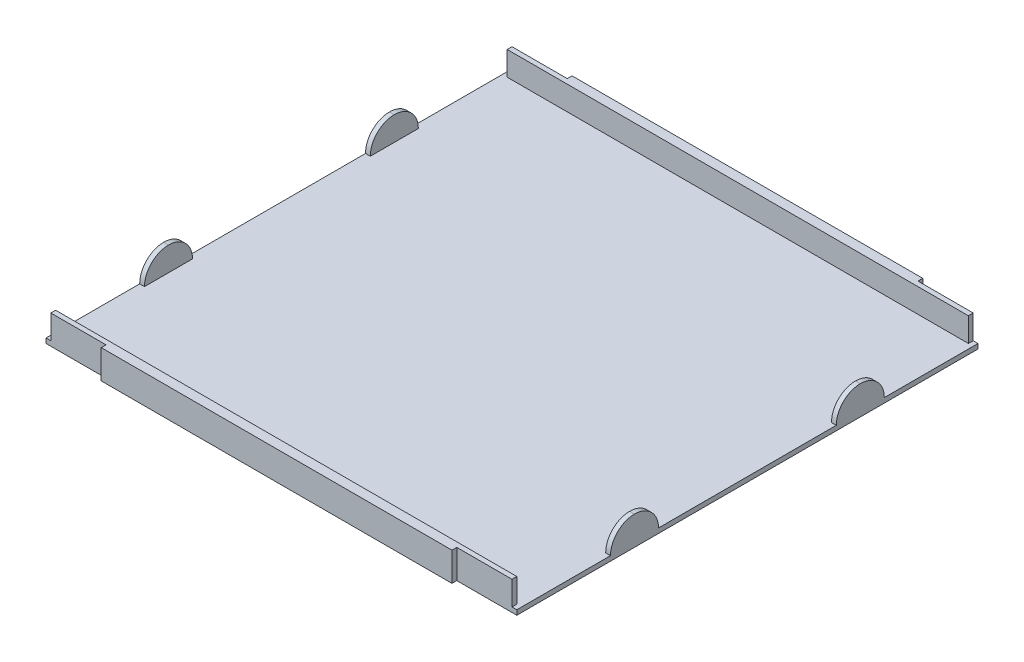
ISO-10303-21;
HEADER;
FILE_DESCRIPTION(('STEP AP214'),'2;1');
FILE_NAME('part.step','',(''),(''),'','','');
FILE_SCHEMA(('AUTOMOTIVE_DESIGN { 1 0 10303 214 1 1 1 1 }'));
ENDSEC;
DATA;
#1=APPLICATION_CONTEXT('core data for automotive mechanical design processes');
#2=APPLICATION_PROTOCOL_DEFINITION('international standard','automotive_design',2000,#1);
#3=PRODUCT_CONTEXT('',#1,'mechanical');
#4=PRODUCT('Part','Part','',(#3));
#5=PRODUCT_RELATED_PRODUCT_CATEGORY('part','',(#4));
#6=PRODUCT_DEFINITION_FORMATION('','',#4);
#7=PRODUCT_DEFINITION_CONTEXT('part definition',#1,'design');
#8=PRODUCT_DEFINITION('design','',#6,#7);
#9=PRODUCT_DEFINITION_SHAPE('','',#8);
#10=(LENGTH_UNIT() NAMED_UNIT(*) SI_UNIT(.MILLI.,.METRE.));
#11=(NAMED_UNIT(*) PLANE_ANGLE_UNIT() SI_UNIT($,.RADIAN.));
#12=(NAMED_UNIT(*) SI_UNIT($,.STERADIAN.) SOLID_ANGLE_UNIT());
#13=UNCERTAINTY_MEASURE_WITH_UNIT(LENGTH_MEASURE(1.E-05),#10,'distance_accuracy_value','');
#14=(GEOMETRIC_REPRESENTATION_CONTEXT(3) GLOBAL_UNCERTAINTY_ASSIGNED_CONTEXT((#13)) GLOBAL_UNIT_ASSIGNED_CONTEXT((#10,
#11,#12)) REPRESENTATION_CONTEXT('',''));
#15=CARTESIAN_POINT('',(0.,0.,0.));
#16=DIRECTION('',(0.,0.,1.));
#17=DIRECTION('',(1.,0.,0.));
#18=AXIS2_PLACEMENT_3D('',#15,#16,#17);
#19=CARTESIAN_POINT('',(98.,1.,0.));
#20=DIRECTION('',(-1.,0.,0.));
#21=DIRECTION('',(0.,0.,1.));
#22=AXIS2_PLACEMENT_3D('',#19,#20,#21);
#23=PLANE('',#22);
#24=DIRECTION('',(0.,0.,-1.));
#25=VECTOR('',#24,1.);
#26=CARTESIAN_POINT('',(98.,1.,0.));
#27=LINE('',#26,#25);
#28=CARTESIAN_POINT('',(98.,1.,0.));
#29=VERTEX_POINT('',#28);
#30=CARTESIAN_POINT('',(98.,1.,-19.5));
#31=VERTEX_POINT('',#30);
#32=EDGE_CURVE('E311',#29,#31,#27,.T.);
#33=ORIENTED_EDGE('',*,*,#32,.F.);
#34=DIRECTION('',(0.,-1.,0.));
#35=VECTOR('',#34,1.);
#36=CARTESIAN_POINT('',(98.,1.,0.));
#37=LINE('',#36,#35);
#38=CARTESIAN_POINT('',(98.,0.,0.));
#39=VERTEX_POINT('',#38);
#40=EDGE_CURVE('E341',#29,#39,#37,.T.);
#41=ORIENTED_EDGE('',*,*,#40,.T.);
#42=DIRECTION('',(0.,0.,-1.));
#43=VECTOR('',#42,1.);
#44=CARTESIAN_POINT('',(98.,0.,0.));
#45=LINE('',#44,#43);
#46=CARTESIAN_POINT('',(98.,0.,-96.));
#47=VERTEX_POINT('',#46);
#48=EDGE_CURVE('E325',#39,#47,#45,.T.);
#49=ORIENTED_EDGE('',*,*,#48,.T.);
#50=DIRECTION('',(0.,-1.,0.));
#51=VECTOR('',#50,1.);
#52=CARTESIAN_POINT('',(98.,1.,-96.));
#53=LINE('',#52,#51);
#54=CARTESIAN_POINT('',(98.,1.,-96.));
#55=VERTEX_POINT('',#54);
#56=EDGE_CURVE('E339',#55,#47,#53,.T.);
#57=ORIENTED_EDGE('',*,*,#56,.F.);
#58=CARTESIAN_POINT('',(98.,1.,-76.5));
#59=VERTEX_POINT('',#58);
#60=EDGE_CURVE('E316',#59,#55,#27,.T.);
#61=ORIENTED_EDGE('',*,*,#60,.F.);
#62=CARTESIAN_POINT('',(98.,1.,-71.5));
#63=DIRECTION('',(-1.,0.,0.));
#64=DIRECTION('',(0.,0.,1.));
#65=AXIS2_PLACEMENT_3D('',#62,#63,#64);
#66=CIRCLE('',#65,5.);
#67=CARTESIAN_POINT('',(98.,6.,-71.5));
#68=VERTEX_POINT('',#67);
#69=EDGE_CURVE('E406',#59,#68,#66,.F.);
#70=ORIENTED_EDGE('',*,*,#69,.T.);
#71=CARTESIAN_POINT('',(98.,1.,-71.5));
#72=DIRECTION('',(-1.,0.,0.));
#73=DIRECTION('',(0.,0.,1.));
#74=AXIS2_PLACEMENT_3D('',#71,#72,#73);
#75=CIRCLE('',#74,5.);
#76=CARTESIAN_POINT('',(98.,1.,-66.5));
#77=VERTEX_POINT('',#76);
#78=EDGE_CURVE('E408',#68,#77,#75,.F.);
#79=ORIENTED_EDGE('',*,*,#78,.T.);
#80=CARTESIAN_POINT('',(98.,1.,-29.5));
#81=VERTEX_POINT('',#80);
#82=EDGE_CURVE('E315',#81,#77,#27,.T.);
#83=ORIENTED_EDGE('',*,*,#82,.F.);
#84=CARTESIAN_POINT('',(98.,1.,-24.5));
#85=DIRECTION('',(-1.,0.,0.));
#86=DIRECTION('',(0.,0.,1.));
#87=AXIS2_PLACEMENT_3D('',#84,#85,#86);
#88=CIRCLE('',#87,5.);
#89=CARTESIAN_POINT('',(98.,6.,-24.5));
#90=VERTEX_POINT('',#89);
#91=EDGE_CURVE('E357',#81,#90,#88,.F.);
#92=ORIENTED_EDGE('',*,*,#91,.T.);
#93=CARTESIAN_POINT('',(98.,1.,-24.5));
#94=DIRECTION('',(-1.,0.,0.));
#95=DIRECTION('',(0.,0.,1.));
#96=AXIS2_PLACEMENT_3D('',#93,#94,#95);
#97=CIRCLE('',#96,5.);
#98=EDGE_CURVE('E379',#90,#31,#97,.F.);
#99=ORIENTED_EDGE('',*,*,#98,.T.);
#100=EDGE_LOOP('',(#33,#41,#49,#57,#61,#70,#79,#83,#92,#99));
#101=FACE_BOUND('',#100,.T.);
#102=ADVANCED_FACE('F41',(#101),#23,.F.);
#103=CARTESIAN_POINT('',(0.,1.,0.));
#104=DIRECTION('',(0.,1.,0.));
#105=DIRECTION('',(0.,0.,1.));
#106=AXIS2_PLACEMENT_3D('',#103,#104,#105);
#107=PLANE('',#106);
#108=DIRECTION('',(0.,0.,1.));
#109=VECTOR('',#108,1.);
#110=CARTESIAN_POINT('',(97.,1.,-29.5));
#111=LINE('',#110,#109);
#112=CARTESIAN_POINT('',(97.,1.,-29.5));
#113=VERTEX_POINT('',#112);
#114=CARTESIAN_POINT('',(97.,1.,-19.5));
#115=VERTEX_POINT('',#114);
#116=EDGE_CURVE('E431',#113,#115,#111,.T.);
#117=ORIENTED_EDGE('',*,*,#116,.F.);
#118=DIRECTION('',(-1.,0.,0.));
#119=VECTOR('',#118,1.);
#120=CARTESIAN_POINT('',(98.,1.,-29.5));
#121=LINE('',#120,#119);
#122=EDGE_CURVE('E389',#81,#113,#121,.T.);
#123=ORIENTED_EDGE('',*,*,#122,.F.);
#124=ORIENTED_EDGE('',*,*,#82,.T.);
#125=DIRECTION('',(1.,0.,0.));
#126=VECTOR('',#125,1.);
#127=CARTESIAN_POINT('',(98.,1.,-66.5));
#128=LINE('',#127,#126);
#129=CARTESIAN_POINT('',(97.,1.,-66.5));
#130=VERTEX_POINT('',#129);
#131=EDGE_CURVE('E443',#130,#77,#128,.T.);
#132=ORIENTED_EDGE('',*,*,#131,.F.);
#133=DIRECTION('',(0.,0.,1.));
#134=VECTOR('',#133,1.);
#135=CARTESIAN_POINT('',(97.,1.,-76.5));
#136=LINE('',#135,#134);
#137=CARTESIAN_POINT('',(97.,1.,-76.5));
#138=VERTEX_POINT('',#137);
#139=EDGE_CURVE('E440',#138,#130,#136,.T.);
#140=ORIENTED_EDGE('',*,*,#139,.F.);
#141=DIRECTION('',(-1.,0.,0.));
#142=VECTOR('',#141,1.);
#143=CARTESIAN_POINT('',(98.,1.,-76.5));
#144=LINE('',#143,#142);
#145=EDGE_CURVE('E437',#59,#138,#144,.T.);
#146=ORIENTED_EDGE('',*,*,#145,.F.);
#147=ORIENTED_EDGE('',*,*,#60,.T.);
#148=DIRECTION('',(-1.,0.,0.));
#149=VECTOR('',#148,1.);
#150=CARTESIAN_POINT('',(98.,1.,-96.));
#151=LINE('',#150,#149);
#152=CARTESIAN_POINT('',(97.,1.,-96.));
#153=VERTEX_POINT('',#152);
#154=EDGE_CURVE('E517',#55,#153,#151,.T.);
#155=ORIENTED_EDGE('',*,*,#154,.T.);
#156=DIRECTION('',(0.,0.,1.));
#157=VECTOR('',#156,1.);
#158=CARTESIAN_POINT('',(97.,1.,-95.));
#159=LINE('',#158,#157);
#160=CARTESIAN_POINT('',(97.,1.,-95.));
#161=VERTEX_POINT('',#160);
#162=EDGE_CURVE('E58',#153,#161,#159,.T.);
#163=ORIENTED_EDGE('',*,*,#162,.T.);
#164=DIRECTION('',(1.,0.,0.));
#165=VECTOR('',#164,1.);
#166=CARTESIAN_POINT('',(98.,1.,-95.));
#167=LINE('',#166,#165);
#168=CARTESIAN_POINT('',(1.,1.,-95.));
#169=VERTEX_POINT('',#168);
#170=EDGE_CURVE('E290',#169,#161,#167,.T.);
#171=ORIENTED_EDGE('',*,*,#170,.F.);
#172=DIRECTION('',(0.,0.,-1.));
#173=VECTOR('',#172,1.);
#174=CARTESIAN_POINT('',(1.,1.,-95.));
#175=LINE('',#174,#173);
#176=CARTESIAN_POINT('',(1.,1.,-96.));
#177=VERTEX_POINT('',#176);
#178=EDGE_CURVE('E507',#169,#177,#175,.T.);
#179=ORIENTED_EDGE('',*,*,#178,.T.);
#180=DIRECTION('',(-1.,0.,0.));
#181=VECTOR('',#180,1.);
#182=CARTESIAN_POINT('',(0.,1.,-96.));
#183=LINE('',#182,#181);
#184=CARTESIAN_POINT('',(0.,1.,-96.));
#185=VERTEX_POINT('',#184);
#186=EDGE_CURVE('E501',#177,#185,#183,.T.);
#187=ORIENTED_EDGE('',*,*,#186,.T.);
#188=DIRECTION('',(0.,0.,-1.));
#189=VECTOR('',#188,1.);
#190=CARTESIAN_POINT('',(0.,1.,0.));
#191=LINE('',#190,#189);
#192=CARTESIAN_POINT('',(0.,1.,-76.5));
#193=VERTEX_POINT('',#192);
#194=EDGE_CURVE('E314',#193,#185,#191,.T.);
#195=ORIENTED_EDGE('',*,*,#194,.F.);
#196=DIRECTION('',(-1.,0.,0.));
#197=VECTOR('',#196,1.);
#198=CARTESIAN_POINT('',(0.,1.,-76.5));
#199=LINE('',#198,#197);
#200=CARTESIAN_POINT('',(1.,1.,-76.5));
#201=VERTEX_POINT('',#200);
#202=EDGE_CURVE('E273',#201,#193,#199,.T.);
#203=ORIENTED_EDGE('',*,*,#202,.F.);
#204=DIRECTION('',(0.,0.,-1.));
#205=VECTOR('',#204,1.);
#206=CARTESIAN_POINT('',(1.,1.,-76.5));
#207=LINE('',#206,#205);
#208=CARTESIAN_POINT('',(1.,1.,-66.5));
#209=VERTEX_POINT('',#208);
#210=EDGE_CURVE('E278',#209,#201,#207,.T.);
#211=ORIENTED_EDGE('',*,*,#210,.F.);
#212=DIRECTION('',(1.,0.,0.));
#213=VECTOR('',#212,1.);
#214=CARTESIAN_POINT('',(0.,1.,-66.5));
#215=LINE('',#214,#213);
#216=CARTESIAN_POINT('',(0.,1.,-66.5));
#217=VERTEX_POINT('',#216);
#218=EDGE_CURVE('E455',#217,#209,#215,.T.);
#219=ORIENTED_EDGE('',*,*,#218,.F.);
#220=CARTESIAN_POINT('',(0.,1.,-29.5));
#221=VERTEX_POINT('',#220);
#222=EDGE_CURVE('E321',#221,#217,#191,.T.);
#223=ORIENTED_EDGE('',*,*,#222,.F.);
#224=DIRECTION('',(-1.,0.,0.));
#225=VECTOR('',#224,1.);
#226=CARTESIAN_POINT('',(0.,1.,-29.5));
#227=LINE('',#226,#225);
#228=CARTESIAN_POINT('',(1.,1.,-29.5));
#229=VERTEX_POINT('',#228);
#230=EDGE_CURVE('E452',#229,#221,#227,.T.);
#231=ORIENTED_EDGE('',*,*,#230,.F.);
#232=DIRECTION('',(0.,0.,-1.));
#233=VECTOR('',#232,1.);
#234=CARTESIAN_POINT('',(1.,1.,-29.5));
#235=LINE('',#234,#233);
#236=CARTESIAN_POINT('',(1.,1.,-19.5));
#237=VERTEX_POINT('',#236);
#238=EDGE_CURVE('E449',#237,#229,#235,.T.);
#239=ORIENTED_EDGE('',*,*,#238,.F.);
#240=DIRECTION('',(1.,0.,0.));
#241=VECTOR('',#240,1.);
#242=CARTESIAN_POINT('',(0.,1.,-19.5));
#243=LINE('',#242,#241);
#244=CARTESIAN_POINT('',(0.,1.,-19.5));
#245=VERTEX_POINT('',#244);
#246=EDGE_CURVE('E446',#245,#237,#243,.T.);
#247=ORIENTED_EDGE('',*,*,#246,.F.);
#248=CARTESIAN_POINT('',(0.,1.,0.));
#249=VERTEX_POINT('',#248);
#250=EDGE_CURVE('E317',#249,#245,#191,.T.);
#251=ORIENTED_EDGE('',*,*,#250,.F.);
#252=DIRECTION('',(1.,0.,0.));
#253=VECTOR('',#252,1.);
#254=CARTESIAN_POINT('',(0.,1.,0.));
#255=LINE('',#254,#253);
#256=CARTESIAN_POINT('',(1.,1.,0.));
#257=VERTEX_POINT('',#256);
#258=EDGE_CURVE('E489',#249,#257,#255,.T.);
#259=ORIENTED_EDGE('',*,*,#258,.T.);
#260=DIRECTION('',(0.,0.,-1.));
#261=VECTOR('',#260,1.);
#262=CARTESIAN_POINT('',(1.,1.,0.));
#263=LINE('',#262,#261);
#264=CARTESIAN_POINT('',(1.,1.,-0.999999999999987));
#265=VERTEX_POINT('',#264);
#266=EDGE_CURVE('E271',#257,#265,#263,.T.);
#267=ORIENTED_EDGE('',*,*,#266,.T.);
#268=DIRECTION('',(-1.,0.,0.));
#269=VECTOR('',#268,1.);
#270=CARTESIAN_POINT('',(98.,1.,-1.));
#271=LINE('',#270,#269);
#272=CARTESIAN_POINT('',(97.,1.,-1.));
#273=VERTEX_POINT('',#272);
#274=EDGE_CURVE('E66',#273,#265,#271,.T.);
#275=ORIENTED_EDGE('',*,*,#274,.F.);
#276=DIRECTION('',(0.,0.,1.));
#277=VECTOR('',#276,1.);
#278=CARTESIAN_POINT('',(97.,1.,0.));
#279=LINE('',#278,#277);
#280=CARTESIAN_POINT('',(97.,1.,0.));
#281=VERTEX_POINT('',#280);
#282=EDGE_CURVE('E253',#273,#281,#279,.T.);
#283=ORIENTED_EDGE('',*,*,#282,.T.);
#284=DIRECTION('',(1.,0.,0.));
#285=VECTOR('',#284,1.);
#286=CARTESIAN_POINT('',(98.,1.,0.));
#287=LINE('',#286,#285);
#288=EDGE_CURVE('E261',#281,#29,#287,.T.);
#289=ORIENTED_EDGE('',*,*,#288,.T.);
#290=ORIENTED_EDGE('',*,*,#32,.T.);
#291=DIRECTION('',(1.,0.,0.));
#292=VECTOR('',#291,1.);
#293=CARTESIAN_POINT('',(98.,1.,-19.5));
#294=LINE('',#293,#292);
#295=EDGE_CURVE('E434',#115,#31,#294,.T.);
#296=ORIENTED_EDGE('',*,*,#295,.F.);
#297=EDGE_LOOP('',(#117,#123,#124,#132,#140,#146,#147,#155,#163,#171,#179,#187,#195,#203,#211,
#219,#223,#231,#239,#247,#251,#259,#267,#275,#283,#289,#290,#296));
#298=FACE_BOUND('',#297,.T.);
#299=ADVANCED_FACE('F269',(#298),#107,.T.);
#300=CARTESIAN_POINT('',(0.,1.,0.));
#301=DIRECTION('',(-1.,0.,0.));
#302=DIRECTION('',(0.,0.,1.));
#303=AXIS2_PLACEMENT_3D('',#300,#301,#302);
#304=PLANE('',#303);
#305=ORIENTED_EDGE('',*,*,#194,.T.);
#306=DIRECTION('',(0.,-1.,0.));
#307=VECTOR('',#306,1.);
#308=CARTESIAN_POINT('',(0.,1.,-96.));
#309=LINE('',#308,#307);
#310=CARTESIAN_POINT('',(0.,0.,-96.));
#311=VERTEX_POINT('',#310);
#312=EDGE_CURVE('E337',#185,#311,#309,.T.);
#313=ORIENTED_EDGE('',*,*,#312,.T.);
#314=DIRECTION('',(0.,0.,-1.));
#315=VECTOR('',#314,1.);
#316=CARTESIAN_POINT('',(0.,0.,0.));
#317=LINE('',#316,#315);
#318=CARTESIAN_POINT('',(0.,0.,0.));
#319=VERTEX_POINT('',#318);
#320=EDGE_CURVE('E333',#319,#311,#317,.T.);
#321=ORIENTED_EDGE('',*,*,#320,.F.);
#322=DIRECTION('',(0.,-1.,0.));
#323=VECTOR('',#322,1.);
#324=CARTESIAN_POINT('',(0.,1.,0.));
#325=LINE('',#324,#323);
#326=EDGE_CURVE('E320',#249,#319,#325,.T.);
#327=ORIENTED_EDGE('',*,*,#326,.F.);
#328=ORIENTED_EDGE('',*,*,#250,.T.);
#329=CARTESIAN_POINT('',(0.,1.,-24.5));
#330=DIRECTION('',(-1.,0.,0.));
#331=DIRECTION('',(0.,0.,1.));
#332=AXIS2_PLACEMENT_3D('',#329,#330,#331);
#333=CIRCLE('',#332,5.);
#334=CARTESIAN_POINT('',(0.,6.,-24.5));
#335=VERTEX_POINT('',#334);
#336=EDGE_CURVE('E394',#245,#335,#333,.T.);
#337=ORIENTED_EDGE('',*,*,#336,.T.);
#338=CARTESIAN_POINT('',(0.,1.,-24.5));
#339=DIRECTION('',(-1.,0.,0.));
#340=DIRECTION('',(0.,0.,1.));
#341=AXIS2_PLACEMENT_3D('',#338,#339,#340);
#342=CIRCLE('',#341,5.);
#343=EDGE_CURVE('E396',#335,#221,#342,.T.);
#344=ORIENTED_EDGE('',*,*,#343,.T.);
#345=ORIENTED_EDGE('',*,*,#222,.T.);
#346=CARTESIAN_POINT('',(0.,1.,-71.5));
#347=DIRECTION('',(-1.,0.,0.));
#348=DIRECTION('',(0.,0.,1.));
#349=AXIS2_PLACEMENT_3D('',#346,#347,#348);
#350=CIRCLE('',#349,5.);
#351=CARTESIAN_POINT('',(0.,6.,-71.5));
#352=VERTEX_POINT('',#351);
#353=EDGE_CURVE('E392',#217,#352,#350,.T.);
#354=ORIENTED_EDGE('',*,*,#353,.T.);
#355=CARTESIAN_POINT('',(0.,1.,-71.5));
#356=DIRECTION('',(-1.,0.,0.));
#357=DIRECTION('',(0.,0.,1.));
#358=AXIS2_PLACEMENT_3D('',#355,#356,#357);
#359=CIRCLE('',#358,5.);
#360=EDGE_CURVE('E385',#352,#193,#359,.T.);
#361=ORIENTED_EDGE('',*,*,#360,.T.);
#362=EDGE_LOOP('',(#305,#313,#321,#327,#328,#337,#344,#345,#354,#361));
#363=FACE_BOUND('',#362,.T.);
#364=ADVANCED_FACE('F485',(#363),#304,.T.);
#365=CARTESIAN_POINT('',(0.,0.,0.));
#366=DIRECTION('',(0.,1.,0.));
#367=DIRECTION('',(0.,0.,1.));
#368=AXIS2_PLACEMENT_3D('',#365,#366,#367);
#369=PLANE('',#368);
#370=DIRECTION('',(1.,0.,0.));
#371=VECTOR('',#370,1.);
#372=CARTESIAN_POINT('',(0.,0.,0.));
#373=LINE('',#372,#371);
#374=CARTESIAN_POINT('',(12.5,0.,0.));
#375=VERTEX_POINT('',#374);
#376=EDGE_CURVE('E322',#319,#375,#373,.T.);
#377=ORIENTED_EDGE('',*,*,#376,.F.);
#378=ORIENTED_EDGE('',*,*,#320,.T.);
#379=DIRECTION('',(1.,0.,0.));
#380=VECTOR('',#379,1.);
#381=CARTESIAN_POINT('',(0.,0.,-96.));
#382=LINE('',#381,#380);
#383=CARTESIAN_POINT('',(12.5,0.,-96.));
#384=VERTEX_POINT('',#383);
#385=EDGE_CURVE('E330',#311,#384,#382,.T.);
#386=ORIENTED_EDGE('',*,*,#385,.T.);
#387=DIRECTION('',(0.,0.,-1.));
#388=VECTOR('',#387,1.);
#389=CARTESIAN_POINT('',(12.5,0.,-96.));
#390=LINE('',#389,#388);
#391=CARTESIAN_POINT('',(12.5,0.,-97.));
#392=VERTEX_POINT('',#391);
#393=EDGE_CURVE('E310',#384,#392,#390,.T.);
#394=ORIENTED_EDGE('',*,*,#393,.T.);
#395=DIRECTION('',(1.,0.,0.));
#396=VECTOR('',#395,1.);
#397=CARTESIAN_POINT('',(12.5,0.,-97.));
#398=LINE('',#397,#396);
#399=CARTESIAN_POINT('',(85.5,0.,-97.));
#400=VERTEX_POINT('',#399);
#401=EDGE_CURVE('E367',#392,#400,#398,.T.);
#402=ORIENTED_EDGE('',*,*,#401,.T.);
#403=DIRECTION('',(0.,0.,-1.));
#404=VECTOR('',#403,1.);
#405=CARTESIAN_POINT('',(85.5,0.,-96.));
#406=LINE('',#405,#404);
#407=CARTESIAN_POINT('',(85.5,0.,-96.));
#408=VERTEX_POINT('',#407);
#409=EDGE_CURVE('E370',#408,#400,#406,.T.);
#410=ORIENTED_EDGE('',*,*,#409,.F.);
#411=EDGE_CURVE('E329',#408,#47,#382,.T.);
#412=ORIENTED_EDGE('',*,*,#411,.T.);
#413=ORIENTED_EDGE('',*,*,#48,.F.);
#414=CARTESIAN_POINT('',(85.5,0.,0.));
#415=VERTEX_POINT('',#414);
#416=EDGE_CURVE('E326',#415,#39,#373,.T.);
#417=ORIENTED_EDGE('',*,*,#416,.F.);
#418=DIRECTION('',(0.,0.,1.));
#419=VECTOR('',#418,1.);
#420=CARTESIAN_POINT('',(85.5,0.,0.));
#421=LINE('',#420,#419);
#422=CARTESIAN_POINT('',(85.5,0.,1.));
#423=VERTEX_POINT('',#422);
#424=EDGE_CURVE('E351',#415,#423,#421,.T.);
#425=ORIENTED_EDGE('',*,*,#424,.T.);
#426=DIRECTION('',(1.,0.,0.));
#427=VECTOR('',#426,1.);
#428=CARTESIAN_POINT('',(12.5,0.,1.));
#429=LINE('',#428,#427);
#430=CARTESIAN_POINT('',(12.5,0.,1.));
#431=VERTEX_POINT('',#430);
#432=EDGE_CURVE('E347',#431,#423,#429,.T.);
#433=ORIENTED_EDGE('',*,*,#432,.F.);
#434=DIRECTION('',(0.,0.,1.));
#435=VECTOR('',#434,1.);
#436=CARTESIAN_POINT('',(12.5,0.,0.));
#437=LINE('',#436,#435);
#438=EDGE_CURVE('E344',#375,#431,#437,.T.);
#439=ORIENTED_EDGE('',*,*,#438,.F.);
#440=EDGE_LOOP('',(#377,#378,#386,#394,#402,#410,#412,#413,#417,#425,#433,#439));
#441=FACE_BOUND('',#440,.T.);
#442=ADVANCED_FACE('F579',(#441),#369,.F.);
#443=CARTESIAN_POINT('',(0.,1.,-96.));
#444=DIRECTION('',(0.,0.,-1.));
#445=DIRECTION('',(-1.,0.,0.));
#446=AXIS2_PLACEMENT_3D('',#443,#444,#445);
#447=PLANE('',#446);
#448=DIRECTION('',(0.,1.,0.));
#449=VECTOR('',#448,1.);
#450=CARTESIAN_POINT('',(1.,1.,-96.));
#451=LINE('',#450,#449);
#452=CARTESIAN_POINT('',(1.,6.,-96.));
#453=VERTEX_POINT('',#452);
#454=EDGE_CURVE('E500',#177,#453,#451,.T.);
#455=ORIENTED_EDGE('',*,*,#454,.T.);
#456=DIRECTION('',(-1.,0.,0.));
#457=VECTOR('',#456,1.);
#458=CARTESIAN_POINT('',(98.,6.,-96.));
#459=LINE('',#458,#457);
#460=CARTESIAN_POINT('',(12.5,6.,-96.));
#461=VERTEX_POINT('',#460);
#462=EDGE_CURVE('E286',#461,#453,#459,.T.);
#463=ORIENTED_EDGE('',*,*,#462,.F.);
#464=DIRECTION('',(0.,-1.,0.));
#465=VECTOR('',#464,1.);
#466=CARTESIAN_POINT('',(12.5,1.,-96.));
#467=LINE('',#466,#465);
#468=EDGE_CURVE('E343',#461,#384,#467,.T.);
#469=ORIENTED_EDGE('',*,*,#468,.T.);
#470=ORIENTED_EDGE('',*,*,#385,.F.);
#471=ORIENTED_EDGE('',*,*,#312,.F.);
#472=ORIENTED_EDGE('',*,*,#186,.F.);
#473=EDGE_LOOP('',(#455,#463,#469,#470,#471,#472));
#474=FACE_BOUND('',#473,.T.);
#475=ADVANCED_FACE('F575',(#474),#447,.T.);
#476=DIRECTION('',(0.,1.,0.));
#477=VECTOR('',#476,1.);
#478=CARTESIAN_POINT('',(97.,1.,-96.));
#479=LINE('',#478,#477);
#480=CARTESIAN_POINT('',(97.,6.,-96.));
#481=VERTEX_POINT('',#480);
#482=EDGE_CURVE('E511',#153,#481,#479,.T.);
#483=ORIENTED_EDGE('',*,*,#482,.F.);
#484=ORIENTED_EDGE('',*,*,#154,.F.);
#485=ORIENTED_EDGE('',*,*,#56,.T.);
#486=ORIENTED_EDGE('',*,*,#411,.F.);
#487=DIRECTION('',(0.,-1.,0.));
#488=VECTOR('',#487,1.);
#489=CARTESIAN_POINT('',(85.5,1.,-96.));
#490=LINE('',#489,#488);
#491=CARTESIAN_POINT('',(85.5,6.,-96.));
#492=VERTEX_POINT('',#491);
#493=EDGE_CURVE('E360',#492,#408,#490,.T.);
#494=ORIENTED_EDGE('',*,*,#493,.F.);
#495=EDGE_CURVE('E283',#481,#492,#459,.T.);
#496=ORIENTED_EDGE('',*,*,#495,.F.);
#497=EDGE_LOOP('',(#483,#484,#485,#486,#494,#496));
#498=FACE_BOUND('',#497,.T.);
#499=ADVANCED_FACE('F555',(#498),#447,.T.);
#500=CARTESIAN_POINT('',(0.,1.,0.));
#501=DIRECTION('',(0.,0.,-1.));
#502=DIRECTION('',(-1.,0.,0.));
#503=AXIS2_PLACEMENT_3D('',#500,#501,#502);
#504=PLANE('',#503);
#505=ORIENTED_EDGE('',*,*,#288,.F.);
#506=DIRECTION('',(0.,1.,0.));
#507=VECTOR('',#506,1.);
#508=CARTESIAN_POINT('',(97.,1.,0.));
#509=LINE('',#508,#507);
#510=CARTESIAN_POINT('',(97.,6.,0.));
#511=VERTEX_POINT('',#510);
#512=EDGE_CURVE('E258',#281,#511,#509,.T.);
#513=ORIENTED_EDGE('',*,*,#512,.T.);
#514=DIRECTION('',(1.,0.,0.));
#515=VECTOR('',#514,1.);
#516=CARTESIAN_POINT('',(98.,6.,0.));
#517=LINE('',#516,#515);
#518=CARTESIAN_POINT('',(85.5,6.,0.));
#519=VERTEX_POINT('',#518);
#520=EDGE_CURVE('E275',#519,#511,#517,.T.);
#521=ORIENTED_EDGE('',*,*,#520,.F.);
#522=DIRECTION('',(0.,-1.,0.));
#523=VECTOR('',#522,1.);
#524=CARTESIAN_POINT('',(85.5,1.,0.));
#525=LINE('',#524,#523);
#526=EDGE_CURVE('E358',#519,#415,#525,.T.);
#527=ORIENTED_EDGE('',*,*,#526,.T.);
#528=ORIENTED_EDGE('',*,*,#416,.T.);
#529=ORIENTED_EDGE('',*,*,#40,.F.);
#530=EDGE_LOOP('',(#505,#513,#521,#527,#528,#529));
#531=FACE_BOUND('',#530,.T.);
#532=ADVANCED_FACE('F526',(#531),#504,.F.);
#533=CARTESIAN_POINT('',(1.,6.,0.));
#534=VERTEX_POINT('',#533);
#535=CARTESIAN_POINT('',(12.5,6.,0.));
#536=VERTEX_POINT('',#535);
#537=EDGE_CURVE('E282',#534,#536,#517,.T.);
#538=ORIENTED_EDGE('',*,*,#537,.F.);
#539=DIRECTION('',(0.,1.,0.));
#540=VECTOR('',#539,1.);
#541=CARTESIAN_POINT('',(1.,1.,0.));
#542=LINE('',#541,#540);
#543=EDGE_CURVE('E422',#257,#534,#542,.T.);
#544=ORIENTED_EDGE('',*,*,#543,.F.);
#545=ORIENTED_EDGE('',*,*,#258,.F.);
#546=ORIENTED_EDGE('',*,*,#326,.T.);
#547=ORIENTED_EDGE('',*,*,#376,.T.);
#548=DIRECTION('',(0.,-1.,0.));
#549=VECTOR('',#548,1.);
#550=CARTESIAN_POINT('',(12.5,1.,0.));
#551=LINE('',#550,#549);
#552=EDGE_CURVE('E355',#536,#375,#551,.T.);
#553=ORIENTED_EDGE('',*,*,#552,.F.);
#554=EDGE_LOOP('',(#538,#544,#545,#546,#547,#553));
#555=FACE_BOUND('',#554,.T.);
#556=ADVANCED_FACE('F493',(#555),#504,.F.);
#557=CARTESIAN_POINT('',(12.5,1.,-97.));
#558=DIRECTION('',(0.,0.,-1.));
#559=DIRECTION('',(-1.,0.,0.));
#560=AXIS2_PLACEMENT_3D('',#557,#558,#559);
#561=PLANE('',#560);
#562=ORIENTED_EDGE('',*,*,#401,.F.);
#563=DIRECTION('',(0.,-1.,0.));
#564=VECTOR('',#563,1.);
#565=CARTESIAN_POINT('',(12.5,1.,-97.));
#566=LINE('',#565,#564);
#567=CARTESIAN_POINT('',(12.5,6.,-97.));
#568=VERTEX_POINT('',#567);
#569=EDGE_CURVE('E373',#568,#392,#566,.T.);
#570=ORIENTED_EDGE('',*,*,#569,.F.);
#571=DIRECTION('',(-1.,0.,0.));
#572=VECTOR('',#571,1.);
#573=CARTESIAN_POINT('',(12.5,6.,-97.));
#574=LINE('',#573,#572);
#575=CARTESIAN_POINT('',(85.5,6.,-97.));
#576=VERTEX_POINT('',#575);
#577=EDGE_CURVE('E298',#576,#568,#574,.T.);
#578=ORIENTED_EDGE('',*,*,#577,.F.);
#579=DIRECTION('',(0.,-1.,0.));
#580=VECTOR('',#579,1.);
#581=CARTESIAN_POINT('',(85.5,1.,-97.));
#582=LINE('',#581,#580);
#583=EDGE_CURVE('E348',#576,#400,#582,.T.);
#584=ORIENTED_EDGE('',*,*,#583,.T.);
#585=EDGE_LOOP('',(#562,#570,#578,#584));
#586=FACE_BOUND('',#585,.T.);
#587=ADVANCED_FACE('F603',(#586),#561,.T.);
#588=CARTESIAN_POINT('',(12.5,1.,-96.));
#589=DIRECTION('',(-1.,0.,0.));
#590=DIRECTION('',(0.,0.,1.));
#591=AXIS2_PLACEMENT_3D('',#588,#589,#590);
#592=PLANE('',#591);
#593=ORIENTED_EDGE('',*,*,#393,.F.);
#594=ORIENTED_EDGE('',*,*,#468,.F.);
#595=DIRECTION('',(0.,0.,1.));
#596=VECTOR('',#595,1.);
#597=CARTESIAN_POINT('',(12.5,6.,-97.));
#598=LINE('',#597,#596);
#599=EDGE_CURVE('E289',#568,#461,#598,.T.);
#600=ORIENTED_EDGE('',*,*,#599,.F.);
#601=ORIENTED_EDGE('',*,*,#569,.T.);
#602=EDGE_LOOP('',(#593,#594,#600,#601));
#603=FACE_BOUND('',#602,.T.);
#604=ADVANCED_FACE('F606',(#603),#592,.T.);
#605=CARTESIAN_POINT('',(85.5,1.,-96.));
#606=DIRECTION('',(-1.,0.,0.));
#607=DIRECTION('',(0.,0.,1.));
#608=AXIS2_PLACEMENT_3D('',#605,#606,#607);
#609=PLANE('',#608);
#610=ORIENTED_EDGE('',*,*,#409,.T.);
#611=ORIENTED_EDGE('',*,*,#583,.F.);
#612=DIRECTION('',(0.,0.,-1.));
#613=VECTOR('',#612,1.);
#614=CARTESIAN_POINT('',(85.5,6.,-97.));
#615=LINE('',#614,#613);
#616=EDGE_CURVE('E295',#492,#576,#615,.T.);
#617=ORIENTED_EDGE('',*,*,#616,.F.);
#618=ORIENTED_EDGE('',*,*,#493,.T.);
#619=EDGE_LOOP('',(#610,#611,#617,#618));
#620=FACE_BOUND('',#619,.T.);
#621=ADVANCED_FACE('F598',(#620),#609,.F.);
#622=CARTESIAN_POINT('',(12.5,1.,1.));
#623=DIRECTION('',(0.,0.,-1.));
#624=DIRECTION('',(-1.,0.,0.));
#625=AXIS2_PLACEMENT_3D('',#622,#623,#624);
#626=PLANE('',#625);
#627=ORIENTED_EDGE('',*,*,#432,.T.);
#628=DIRECTION('',(0.,-1.,0.));
#629=VECTOR('',#628,1.);
#630=CARTESIAN_POINT('',(85.5,1.,1.));
#631=LINE('',#630,#629);
#632=CARTESIAN_POINT('',(85.5,6.,1.));
#633=VERTEX_POINT('',#632);
#634=EDGE_CURVE('E354',#633,#423,#631,.T.);
#635=ORIENTED_EDGE('',*,*,#634,.F.);
#636=DIRECTION('',(1.,0.,0.));
#637=VECTOR('',#636,1.);
#638=CARTESIAN_POINT('',(12.5,6.,1.));
#639=LINE('',#638,#637);
#640=CARTESIAN_POINT('',(12.5,6.,1.));
#641=VERTEX_POINT('',#640);
#642=EDGE_CURVE('E304',#641,#633,#639,.T.);
#643=ORIENTED_EDGE('',*,*,#642,.F.);
#644=DIRECTION('',(0.,-1.,0.));
#645=VECTOR('',#644,1.);
#646=CARTESIAN_POINT('',(12.5,1.,1.));
#647=LINE('',#646,#645);
#648=EDGE_CURVE('E362',#641,#431,#647,.T.);
#649=ORIENTED_EDGE('',*,*,#648,.T.);
#650=EDGE_LOOP('',(#627,#635,#643,#649));
#651=FACE_BOUND('',#650,.T.);
#652=ADVANCED_FACE('F613',(#651),#626,.F.);
#653=CARTESIAN_POINT('',(85.5,1.,0.));
#654=DIRECTION('',(1.,0.,0.));
#655=DIRECTION('',(0.,0.,-1.));
#656=AXIS2_PLACEMENT_3D('',#653,#654,#655);
#657=PLANE('',#656);
#658=ORIENTED_EDGE('',*,*,#424,.F.);
#659=ORIENTED_EDGE('',*,*,#526,.F.);
#660=DIRECTION('',(0.,0.,-1.));
#661=VECTOR('',#660,1.);
#662=CARTESIAN_POINT('',(85.5,6.,1.));
#663=LINE('',#662,#661);
#664=EDGE_CURVE('E307',#633,#519,#663,.T.);
#665=ORIENTED_EDGE('',*,*,#664,.F.);
#666=ORIENTED_EDGE('',*,*,#634,.T.);
#667=EDGE_LOOP('',(#658,#659,#665,#666));
#668=FACE_BOUND('',#667,.T.);
#669=ADVANCED_FACE('F594',(#668),#657,.T.);
#670=CARTESIAN_POINT('',(12.5,1.,0.));
#671=DIRECTION('',(1.,0.,0.));
#672=DIRECTION('',(0.,0.,-1.));
#673=AXIS2_PLACEMENT_3D('',#670,#671,#672);
#674=PLANE('',#673);
#675=ORIENTED_EDGE('',*,*,#438,.T.);
#676=ORIENTED_EDGE('',*,*,#648,.F.);
#677=DIRECTION('',(0.,0.,1.));
#678=VECTOR('',#677,1.);
#679=CARTESIAN_POINT('',(12.5,6.,1.));
#680=LINE('',#679,#678);
#681=EDGE_CURVE('E301',#536,#641,#680,.T.);
#682=ORIENTED_EDGE('',*,*,#681,.F.);
#683=ORIENTED_EDGE('',*,*,#552,.T.);
#684=EDGE_LOOP('',(#675,#676,#682,#683));
#685=FACE_BOUND('',#684,.T.);
#686=ADVANCED_FACE('F584',(#685),#674,.F.);
#687=CARTESIAN_POINT('',(0.,6.,0.));
#688=DIRECTION('',(0.,-1.,0.));
#689=DIRECTION('',(0.,0.,-1.));
#690=AXIS2_PLACEMENT_3D('',#687,#688,#689);
#691=PLANE('',#690);
#692=ORIENTED_EDGE('',*,*,#520,.T.);
#693=DIRECTION('',(0.,0.,1.));
#694=VECTOR('',#693,1.);
#695=CARTESIAN_POINT('',(97.,6.,0.));
#696=LINE('',#695,#694);
#697=CARTESIAN_POINT('',(97.,6.,-1.));
#698=VERTEX_POINT('',#697);
#699=EDGE_CURVE('E262',#698,#511,#696,.T.);
#700=ORIENTED_EDGE('',*,*,#699,.F.);
#701=DIRECTION('',(-1.,0.,0.));
#702=VECTOR('',#701,1.);
#703=CARTESIAN_POINT('',(98.,6.,-1.));
#704=LINE('',#703,#702);
#705=CARTESIAN_POINT('',(1.,6.,-1.));
#706=VERTEX_POINT('',#705);
#707=EDGE_CURVE('E266',#698,#706,#704,.T.);
#708=ORIENTED_EDGE('',*,*,#707,.T.);
#709=DIRECTION('',(0.,0.,-1.));
#710=VECTOR('',#709,1.);
#711=CARTESIAN_POINT('',(1.,6.,0.));
#712=LINE('',#711,#710);
#713=EDGE_CURVE('E426',#534,#706,#712,.T.);
#714=ORIENTED_EDGE('',*,*,#713,.F.);
#715=ORIENTED_EDGE('',*,*,#537,.T.);
#716=ORIENTED_EDGE('',*,*,#681,.T.);
#717=ORIENTED_EDGE('',*,*,#642,.T.);
#718=ORIENTED_EDGE('',*,*,#664,.T.);
#719=EDGE_LOOP('',(#692,#700,#708,#714,#715,#716,#717,#718));
#720=FACE_BOUND('',#719,.T.);
#721=ADVANCED_FACE('F588',(#720),#691,.F.);
#722=CARTESIAN_POINT('',(0.,6.,0.));
#723=DIRECTION('',(0.,1.,0.));
#724=DIRECTION('',(0.,0.,1.));
#725=AXIS2_PLACEMENT_3D('',#722,#723,#724);
#726=PLANE('',#725);
#727=DIRECTION('',(0.,0.,1.));
#728=VECTOR('',#727,1.);
#729=CARTESIAN_POINT('',(97.,6.,-95.));
#730=LINE('',#729,#728);
#731=CARTESIAN_POINT('',(97.,6.,-95.));
#732=VERTEX_POINT('',#731);
#733=EDGE_CURVE('E504',#481,#732,#730,.T.);
#734=ORIENTED_EDGE('',*,*,#733,.F.);
#735=ORIENTED_EDGE('',*,*,#495,.T.);
#736=ORIENTED_EDGE('',*,*,#616,.T.);
#737=ORIENTED_EDGE('',*,*,#577,.T.);
#738=ORIENTED_EDGE('',*,*,#599,.T.);
#739=ORIENTED_EDGE('',*,*,#462,.T.);
#740=DIRECTION('',(0.,0.,-1.));
#741=VECTOR('',#740,1.);
#742=CARTESIAN_POINT('',(1.,6.,-95.));
#743=LINE('',#742,#741);
#744=CARTESIAN_POINT('',(1.,6.,-95.));
#745=VERTEX_POINT('',#744);
#746=EDGE_CURVE('E505',#745,#453,#743,.T.);
#747=ORIENTED_EDGE('',*,*,#746,.F.);
#748=DIRECTION('',(1.,0.,0.));
#749=VECTOR('',#748,1.);
#750=CARTESIAN_POINT('',(98.,6.,-95.));
#751=LINE('',#750,#749);
#752=EDGE_CURVE('E285',#745,#732,#751,.T.);
#753=ORIENTED_EDGE('',*,*,#752,.T.);
#754=EDGE_LOOP('',(#734,#735,#736,#737,#738,#739,#747,#753));
#755=FACE_BOUND('',#754,.T.);
#756=ADVANCED_FACE('F564',(#755),#726,.T.);
#757=CARTESIAN_POINT('',(98.,6.,-95.));
#758=DIRECTION('',(0.,0.,-1.));
#759=DIRECTION('',(-1.,0.,0.));
#760=AXIS2_PLACEMENT_3D('',#757,#758,#759);
#761=PLANE('',#760);
#762=ORIENTED_EDGE('',*,*,#170,.T.);
#763=DIRECTION('',(0.,1.,0.));
#764=VECTOR('',#763,1.);
#765=CARTESIAN_POINT('',(97.,1.,-95.));
#766=LINE('',#765,#764);
#767=EDGE_CURVE('E513',#161,#732,#766,.T.);
#768=ORIENTED_EDGE('',*,*,#767,.T.);
#769=ORIENTED_EDGE('',*,*,#752,.F.);
#770=DIRECTION('',(0.,1.,0.));
#771=VECTOR('',#770,1.);
#772=CARTESIAN_POINT('',(1.,1.,-95.));
#773=LINE('',#772,#771);
#774=EDGE_CURVE('E498',#169,#745,#773,.T.);
#775=ORIENTED_EDGE('',*,*,#774,.F.);
#776=EDGE_LOOP('',(#762,#768,#769,#775));
#777=FACE_BOUND('',#776,.T.);
#778=ADVANCED_FACE('F570',(#777),#761,.F.);
#779=CARTESIAN_POINT('',(98.,6.,-1.));
#780=DIRECTION('',(0.,0.,1.));
#781=DIRECTION('',(1.,0.,0.));
#782=AXIS2_PLACEMENT_3D('',#779,#780,#781);
#783=PLANE('',#782);
#784=ORIENTED_EDGE('',*,*,#707,.F.);
#785=DIRECTION('',(0.,1.,0.));
#786=VECTOR('',#785,1.);
#787=CARTESIAN_POINT('',(97.,1.,-1.));
#788=LINE('',#787,#786);
#789=EDGE_CURVE('E255',#273,#698,#788,.T.);
#790=ORIENTED_EDGE('',*,*,#789,.F.);
#791=ORIENTED_EDGE('',*,*,#274,.T.);
#792=DIRECTION('',(0.,1.,0.));
#793=VECTOR('',#792,1.);
#794=CARTESIAN_POINT('',(1.,1.,-1.));
#795=LINE('',#794,#793);
#796=EDGE_CURVE('E418',#265,#706,#795,.T.);
#797=ORIENTED_EDGE('',*,*,#796,.T.);
#798=EDGE_LOOP('',(#784,#790,#791,#797));
#799=FACE_BOUND('',#798,.T.);
#800=ADVANCED_FACE('F265',(#799),#783,.F.);
#801=CARTESIAN_POINT('',(1.,6.,-76.5));
#802=DIRECTION('',(-1.,0.,0.));
#803=DIRECTION('',(0.,0.,1.));
#804=AXIS2_PLACEMENT_3D('',#801,#802,#803);
#805=PLANE('',#804);
#806=CARTESIAN_POINT('',(1.,1.,-71.5));
#807=DIRECTION('',(-1.,0.,0.));
#808=DIRECTION('',(0.,0.,1.));
#809=AXIS2_PLACEMENT_3D('',#806,#807,#808);
#810=CIRCLE('',#809,5.);
#811=CARTESIAN_POINT('',(1.,6.,-71.5));
#812=VERTEX_POINT('',#811);
#813=EDGE_CURVE('E402',#201,#812,#810,.F.);
#814=ORIENTED_EDGE('',*,*,#813,.T.);
#815=CARTESIAN_POINT('',(1.,1.,-71.5));
#816=DIRECTION('',(-1.,0.,0.));
#817=DIRECTION('',(0.,0.,1.));
#818=AXIS2_PLACEMENT_3D('',#815,#816,#817);
#819=CIRCLE('',#818,5.);
#820=EDGE_CURVE('E404',#812,#209,#819,.F.);
#821=ORIENTED_EDGE('',*,*,#820,.T.);
#822=ORIENTED_EDGE('',*,*,#210,.T.);
#823=EDGE_LOOP('',(#814,#821,#822));
#824=FACE_BOUND('',#823,.T.);
#825=ADVANCED_FACE('F461',(#824),#805,.F.);
#826=CARTESIAN_POINT('',(1.,6.,-29.5));
#827=DIRECTION('',(-1.,0.,0.));
#828=DIRECTION('',(0.,0.,1.));
#829=AXIS2_PLACEMENT_3D('',#826,#827,#828);
#830=PLANE('',#829);
#831=ORIENTED_EDGE('',*,*,#238,.T.);
#832=CARTESIAN_POINT('',(1.,1.,-24.5));
#833=DIRECTION('',(-1.,0.,0.));
#834=DIRECTION('',(0.,0.,1.));
#835=AXIS2_PLACEMENT_3D('',#832,#833,#834);
#836=CIRCLE('',#835,5.);
#837=CARTESIAN_POINT('',(1.,6.,-24.5));
#838=VERTEX_POINT('',#837);
#839=EDGE_CURVE('E400',#229,#838,#836,.F.);
#840=ORIENTED_EDGE('',*,*,#839,.T.);
#841=CARTESIAN_POINT('',(1.,1.,-24.5));
#842=DIRECTION('',(-1.,0.,0.));
#843=DIRECTION('',(0.,0.,1.));
#844=AXIS2_PLACEMENT_3D('',#841,#842,#843);
#845=CIRCLE('',#844,5.);
#846=EDGE_CURVE('E398',#838,#237,#845,.F.);
#847=ORIENTED_EDGE('',*,*,#846,.T.);
#848=EDGE_LOOP('',(#831,#840,#847));
#849=FACE_BOUND('',#848,.T.);
#850=ADVANCED_FACE('F481',(#849),#830,.F.);
#851=CARTESIAN_POINT('',(97.,6.,-76.5));
#852=DIRECTION('',(1.,0.,0.));
#853=DIRECTION('',(0.,0.,-1.));
#854=AXIS2_PLACEMENT_3D('',#851,#852,#853);
#855=PLANE('',#854);
#856=ORIENTED_EDGE('',*,*,#139,.T.);
#857=CARTESIAN_POINT('',(97.,1.,-71.5));
#858=DIRECTION('',(1.,0.,0.));
#859=DIRECTION('',(0.,0.,-1.));
#860=AXIS2_PLACEMENT_3D('',#857,#858,#859);
#861=CIRCLE('',#860,5.);
#862=CARTESIAN_POINT('',(97.,6.,-71.5));
#863=VERTEX_POINT('',#862);
#864=EDGE_CURVE('E11',#130,#863,#861,.F.);
#865=ORIENTED_EDGE('',*,*,#864,.T.);
#866=CARTESIAN_POINT('',(97.,1.,-71.5));
#867=DIRECTION('',(1.,0.,0.));
#868=DIRECTION('',(0.,0.,-1.));
#869=AXIS2_PLACEMENT_3D('',#866,#867,#868);
#870=CIRCLE('',#869,5.);
#871=EDGE_CURVE('E50',#863,#138,#870,.F.);
#872=ORIENTED_EDGE('',*,*,#871,.T.);
#873=EDGE_LOOP('',(#856,#865,#872));
#874=FACE_BOUND('',#873,.T.);
#875=ADVANCED_FACE('F548',(#874),#855,.F.);
#876=CARTESIAN_POINT('',(97.,6.,-29.5));
#877=DIRECTION('',(1.,0.,0.));
#878=DIRECTION('',(0.,0.,-1.));
#879=AXIS2_PLACEMENT_3D('',#876,#877,#878);
#880=PLANE('',#879);
#881=ORIENTED_EDGE('',*,*,#116,.T.);
#882=CARTESIAN_POINT('',(97.,1.,-24.5));
#883=DIRECTION('',(1.,0.,0.));
#884=DIRECTION('',(0.,0.,-1.));
#885=AXIS2_PLACEMENT_3D('',#882,#883,#884);
#886=CIRCLE('',#885,5.);
#887=CARTESIAN_POINT('',(97.,6.,-24.5));
#888=VERTEX_POINT('',#887);
#889=EDGE_CURVE('E383',#115,#888,#886,.F.);
#890=ORIENTED_EDGE('',*,*,#889,.T.);
#891=CARTESIAN_POINT('',(97.,1.,-24.5));
#892=DIRECTION('',(1.,0.,0.));
#893=DIRECTION('',(0.,0.,-1.));
#894=AXIS2_PLACEMENT_3D('',#891,#892,#893);
#895=CIRCLE('',#894,5.);
#896=EDGE_CURVE('E381',#888,#113,#895,.F.);
#897=ORIENTED_EDGE('',*,*,#896,.T.);
#898=EDGE_LOOP('',(#881,#890,#897));
#899=FACE_BOUND('',#898,.T.);
#900=ADVANCED_FACE('F538',(#899),#880,.F.);
#901=CARTESIAN_POINT('',(0.,1.,-24.5));
#902=DIRECTION('',(-1.,0.,0.));
#903=DIRECTION('',(0.,0.,1.));
#904=AXIS2_PLACEMENT_3D('',#901,#902,#903);
#905=CYLINDRICAL_SURFACE('',#904,5.);
#906=ORIENTED_EDGE('',*,*,#122,.T.);
#907=ORIENTED_EDGE('',*,*,#896,.F.);
#908=DIRECTION('',(-1.,0.,0.));
#909=VECTOR('',#908,1.);
#910=CARTESIAN_POINT('',(0.,6.,-24.5));
#911=LINE('',#910,#909);
#912=EDGE_CURVE('E386',#90,#888,#911,.T.);
#913=ORIENTED_EDGE('',*,*,#912,.F.);
#914=ORIENTED_EDGE('',*,*,#91,.F.);
#915=EDGE_LOOP('',(#906,#907,#913,#914));
#916=FACE_BOUND('',#915,.T.);
#917=ADVANCED_FACE('F541',(#916),#905,.T.);
#918=CARTESIAN_POINT('',(0.,1.,-24.5));
#919=DIRECTION('',(1.,0.,0.));
#920=DIRECTION('',(0.,0.,-1.));
#921=AXIS2_PLACEMENT_3D('',#918,#919,#920);
#922=CYLINDRICAL_SURFACE('',#921,5.);
#923=ORIENTED_EDGE('',*,*,#889,.F.);
#924=ORIENTED_EDGE('',*,*,#295,.T.);
#925=ORIENTED_EDGE('',*,*,#98,.F.);
#926=ORIENTED_EDGE('',*,*,#912,.T.);
#927=EDGE_LOOP('',(#923,#924,#925,#926));
#928=FACE_BOUND('',#927,.T.);
#929=ADVANCED_FACE('F535',(#928),#922,.T.);
#930=CARTESIAN_POINT('',(0.,1.,-24.5));
#931=DIRECTION('',(-1.,0.,0.));
#932=DIRECTION('',(0.,0.,1.));
#933=AXIS2_PLACEMENT_3D('',#930,#931,#932);
#934=CYLINDRICAL_SURFACE('',#933,5.);
#935=ORIENTED_EDGE('',*,*,#246,.T.);
#936=ORIENTED_EDGE('',*,*,#846,.F.);
#937=DIRECTION('',(1.,0.,0.));
#938=VECTOR('',#937,1.);
#939=CARTESIAN_POINT('',(1.,6.,-24.5));
#940=LINE('',#939,#938);
#941=EDGE_CURVE('E390',#335,#838,#940,.T.);
#942=ORIENTED_EDGE('',*,*,#941,.F.);
#943=ORIENTED_EDGE('',*,*,#336,.F.);
#944=EDGE_LOOP('',(#935,#936,#942,#943));
#945=FACE_BOUND('',#944,.T.);
#946=ADVANCED_FACE('F484',(#945),#934,.T.);
#947=CARTESIAN_POINT('',(0.,1.,-24.5));
#948=DIRECTION('',(1.,0.,0.));
#949=DIRECTION('',(0.,0.,-1.));
#950=AXIS2_PLACEMENT_3D('',#947,#948,#949);
#951=CYLINDRICAL_SURFACE('',#950,5.);
#952=ORIENTED_EDGE('',*,*,#839,.F.);
#953=ORIENTED_EDGE('',*,*,#230,.T.);
#954=ORIENTED_EDGE('',*,*,#343,.F.);
#955=ORIENTED_EDGE('',*,*,#941,.T.);
#956=EDGE_LOOP('',(#952,#953,#954,#955));
#957=FACE_BOUND('',#956,.T.);
#958=ADVANCED_FACE('F477',(#957),#951,.T.);
#959=CARTESIAN_POINT('',(0.,1.,-71.5));
#960=DIRECTION('',(1.,0.,0.));
#961=DIRECTION('',(0.,0.,-1.));
#962=AXIS2_PLACEMENT_3D('',#959,#960,#961);
#963=CYLINDRICAL_SURFACE('',#962,5.);
#964=ORIENTED_EDGE('',*,*,#202,.T.);
#965=ORIENTED_EDGE('',*,*,#360,.F.);
#966=DIRECTION('',(-1.,0.,0.));
#967=VECTOR('',#966,1.);
#968=CARTESIAN_POINT('',(0.,6.,-71.5));
#969=LINE('',#968,#967);
#970=EDGE_CURVE('E412',#812,#352,#969,.T.);
#971=ORIENTED_EDGE('',*,*,#970,.F.);
#972=ORIENTED_EDGE('',*,*,#813,.F.);
#973=EDGE_LOOP('',(#964,#965,#971,#972));
#974=FACE_BOUND('',#973,.T.);
#975=ADVANCED_FACE('F468',(#974),#963,.T.);
#976=CARTESIAN_POINT('',(0.,1.,-71.5));
#977=DIRECTION('',(-1.,0.,0.));
#978=DIRECTION('',(0.,0.,1.));
#979=AXIS2_PLACEMENT_3D('',#976,#977,#978);
#980=CYLINDRICAL_SURFACE('',#979,5.);
#981=ORIENTED_EDGE('',*,*,#353,.F.);
#982=ORIENTED_EDGE('',*,*,#218,.T.);
#983=ORIENTED_EDGE('',*,*,#820,.F.);
#984=ORIENTED_EDGE('',*,*,#970,.T.);
#985=EDGE_LOOP('',(#981,#982,#983,#984));
#986=FACE_BOUND('',#985,.T.);
#987=ADVANCED_FACE('F469',(#986),#980,.T.);
#988=CARTESIAN_POINT('',(0.,1.,-71.5));
#989=DIRECTION('',(-1.,0.,0.));
#990=DIRECTION('',(0.,0.,1.));
#991=AXIS2_PLACEMENT_3D('',#988,#989,#990);
#992=CYLINDRICAL_SURFACE('',#991,5.);
#993=ORIENTED_EDGE('',*,*,#145,.T.);
#994=ORIENTED_EDGE('',*,*,#871,.F.);
#995=DIRECTION('',(-1.,0.,0.));
#996=VECTOR('',#995,1.);
#997=CARTESIAN_POINT('',(0.,6.,-71.5));
#998=LINE('',#997,#996);
#999=EDGE_CURVE('E45',#68,#863,#998,.T.);
#1000=ORIENTED_EDGE('',*,*,#999,.F.);
#1001=ORIENTED_EDGE('',*,*,#69,.F.);
#1002=EDGE_LOOP('',(#993,#994,#1000,#1001));
#1003=FACE_BOUND('',#1002,.T.);
#1004=ADVANCED_FACE('F43',(#1003),#992,.T.);
#1005=CARTESIAN_POINT('',(0.,1.,-71.5));
#1006=DIRECTION('',(1.,0.,0.));
#1007=DIRECTION('',(0.,0.,-1.));
#1008=AXIS2_PLACEMENT_3D('',#1005,#1006,#1007);
#1009=CYLINDRICAL_SURFACE('',#1008,5.);
#1010=ORIENTED_EDGE('',*,*,#864,.F.);
#1011=ORIENTED_EDGE('',*,*,#131,.T.);
#1012=ORIENTED_EDGE('',*,*,#78,.F.);
#1013=ORIENTED_EDGE('',*,*,#999,.T.);
#1014=EDGE_LOOP('',(#1010,#1011,#1012,#1013));
#1015=FACE_BOUND('',#1014,.T.);
#1016=ADVANCED_FACE('F545',(#1015),#1009,.T.);
#1017=CARTESIAN_POINT('',(1.,1.,0.));
#1018=DIRECTION('',(1.,0.,0.));
#1019=DIRECTION('',(0.,0.,-1.));
#1020=AXIS2_PLACEMENT_3D('',#1017,#1018,#1019);
#1021=PLANE('',#1020);
#1022=ORIENTED_EDGE('',*,*,#713,.T.);
#1023=ORIENTED_EDGE('',*,*,#796,.F.);
#1024=ORIENTED_EDGE('',*,*,#266,.F.);
#1025=ORIENTED_EDGE('',*,*,#543,.T.);
#1026=EDGE_LOOP('',(#1022,#1023,#1024,#1025));
#1027=FACE_BOUND('',#1026,.T.);
#1028=ADVANCED_FACE('F796',(#1027),#1021,.F.);
#1029=CARTESIAN_POINT('',(97.,1.,0.));
#1030=DIRECTION('',(-1.,0.,0.));
#1031=DIRECTION('',(0.,0.,1.));
#1032=AXIS2_PLACEMENT_3D('',#1029,#1030,#1031);
#1033=PLANE('',#1032);
#1034=ORIENTED_EDGE('',*,*,#699,.T.);
#1035=ORIENTED_EDGE('',*,*,#512,.F.);
#1036=ORIENTED_EDGE('',*,*,#282,.F.);
#1037=ORIENTED_EDGE('',*,*,#789,.T.);
#1038=EDGE_LOOP('',(#1034,#1035,#1036,#1037));
#1039=FACE_BOUND('',#1038,.T.);
#1040=ADVANCED_FACE('F254',(#1039),#1033,.F.);
#1041=CARTESIAN_POINT('',(1.,1.,-95.));
#1042=DIRECTION('',(1.,0.,0.));
#1043=DIRECTION('',(0.,0.,-1.));
#1044=AXIS2_PLACEMENT_3D('',#1041,#1042,#1043);
#1045=PLANE('',#1044);
#1046=ORIENTED_EDGE('',*,*,#746,.T.);
#1047=ORIENTED_EDGE('',*,*,#454,.F.);
#1048=ORIENTED_EDGE('',*,*,#178,.F.);
#1049=ORIENTED_EDGE('',*,*,#774,.T.);
#1050=EDGE_LOOP('',(#1046,#1047,#1048,#1049));
#1051=FACE_BOUND('',#1050,.T.);
#1052=ADVANCED_FACE('F811',(#1051),#1045,.F.);
#1053=CARTESIAN_POINT('',(97.,1.,-95.));
#1054=DIRECTION('',(-1.,0.,0.));
#1055=DIRECTION('',(0.,0.,1.));
#1056=AXIS2_PLACEMENT_3D('',#1053,#1054,#1055);
#1057=PLANE('',#1056);
#1058=ORIENTED_EDGE('',*,*,#733,.T.);
#1059=ORIENTED_EDGE('',*,*,#767,.F.);
#1060=ORIENTED_EDGE('',*,*,#162,.F.);
#1061=ORIENTED_EDGE('',*,*,#482,.T.);
#1062=EDGE_LOOP('',(#1058,#1059,#1060,#1061));
#1063=FACE_BOUND('',#1062,.T.);
#1064=ADVANCED_FACE('F562',(#1063),#1057,.F.);
#1065=CLOSED_SHELL('',(#102,#299,#364,#442,#475,#499,#532,#556,#587,#604,#621,#652,#669,#686,
#721,#756,#778,#800,#825,#850,#875,#900,#917,#929,#946,#958,#975,#987,#1004,#1016,#1028,#1040,
#1052,#1064));
#1066=MANIFOLD_SOLID_BREP('B2',#1065);
#1067=ADVANCED_BREP_SHAPE_REPRESENTATION('',(#18,#1066),#14);
#1068=SHAPE_DEFINITION_REPRESENTATION(#9,#1067);
ENDSEC;
END-ISO-10303-21;
